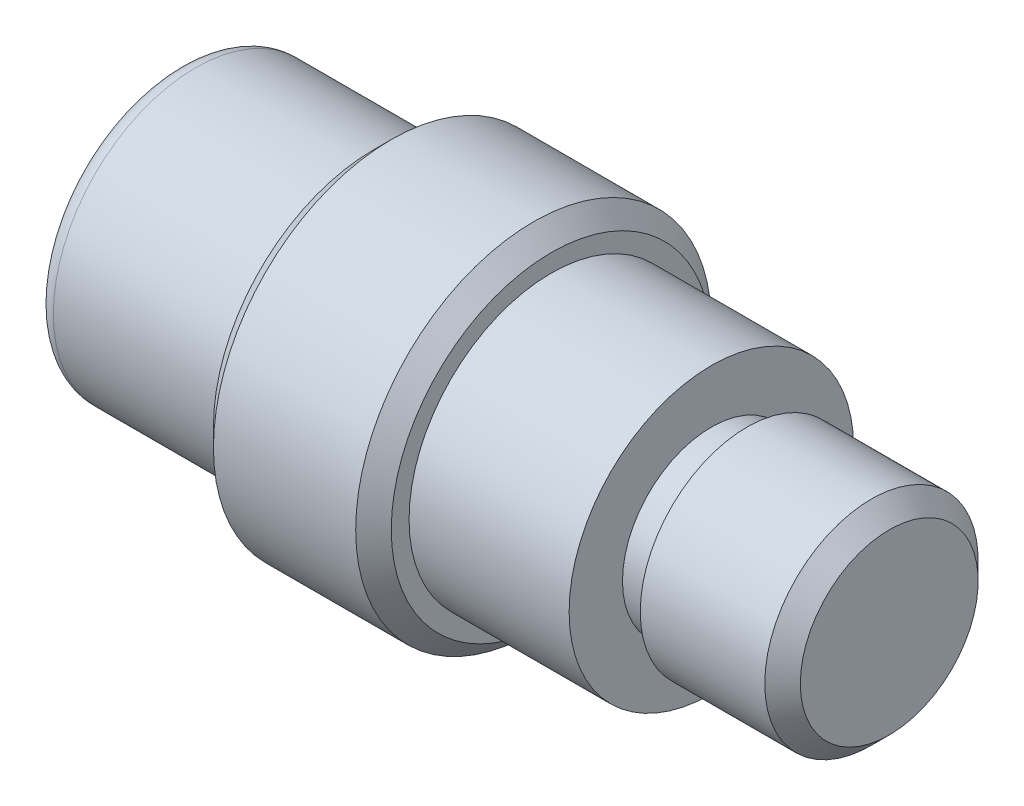
ISO-10303-21;
HEADER;
FILE_DESCRIPTION(('STEP AP214'),'2;1');
FILE_NAME('part.step','',(''),(''),'','','');
FILE_SCHEMA(('AUTOMOTIVE_DESIGN { 1 0 10303 214 1 1 1 1 }'));
ENDSEC;
DATA;
#1=APPLICATION_CONTEXT('core data for automotive mechanical design processes');
#2=APPLICATION_PROTOCOL_DEFINITION('international standard','automotive_design',2000,#1);
#3=PRODUCT_CONTEXT('',#1,'mechanical');
#4=PRODUCT('Part','Part','',(#3));
#5=PRODUCT_RELATED_PRODUCT_CATEGORY('part','',(#4));
#6=PRODUCT_DEFINITION_FORMATION('','',#4);
#7=PRODUCT_DEFINITION_CONTEXT('part definition',#1,'design');
#8=PRODUCT_DEFINITION('design','',#6,#7);
#9=PRODUCT_DEFINITION_SHAPE('','',#8);
#10=(LENGTH_UNIT() NAMED_UNIT(*) SI_UNIT(.MILLI.,.METRE.));
#11=(NAMED_UNIT(*) PLANE_ANGLE_UNIT() SI_UNIT($,.RADIAN.));
#12=(NAMED_UNIT(*) SI_UNIT($,.STERADIAN.) SOLID_ANGLE_UNIT());
#13=UNCERTAINTY_MEASURE_WITH_UNIT(LENGTH_MEASURE(1.E-05),#10,'distance_accuracy_value','');
#14=(GEOMETRIC_REPRESENTATION_CONTEXT(3) GLOBAL_UNCERTAINTY_ASSIGNED_CONTEXT((#13)) GLOBAL_UNIT_ASSIGNED_CONTEXT((#10,
#11,#12)) REPRESENTATION_CONTEXT('',''));
#15=CARTESIAN_POINT('',(0.,0.,0.));
#16=DIRECTION('',(0.,0.,1.));
#17=DIRECTION('',(1.,0.,0.));
#18=AXIS2_PLACEMENT_3D('',#15,#16,#17);
#19=CARTESIAN_POINT('',(40.,6.00000000000001,0.));
#20=DIRECTION('',(-1.,0.,0.));
#21=DIRECTION('',(0.,0.,1.));
#22=AXIS2_PLACEMENT_3D('',#19,#20,#21);
#23=PLANE('',#22);
#24=CARTESIAN_POINT('',(40.,0.,0.));
#25=DIRECTION('',(-1.,0.,0.));
#26=DIRECTION('',(0.,0.,1.));
#27=AXIS2_PLACEMENT_3D('',#24,#25,#26);
#28=CIRCLE('',#27,4.99999999999999);
#29=CARTESIAN_POINT('',(40.,0.,4.99999999999999));
#30=VERTEX_POINT('',#29);
#31=EDGE_CURVE('E10',#30,#30,#28,.F.);
#32=ORIENTED_EDGE('',*,*,#31,.T.);
#33=EDGE_LOOP('',(#32));
#34=FACE_BOUND('',#33,.T.);
#35=ADVANCED_FACE('F35',(#34),#23,.F.);
#36=CARTESIAN_POINT('',(0.,0.,0.));
#37=DIRECTION('',(-1.,0.,0.));
#38=DIRECTION('',(0.,0.,1.));
#39=AXIS2_PLACEMENT_3D('',#36,#37,#38);
#40=CYLINDRICAL_SURFACE('',#39,6.00000000000001);
#41=CARTESIAN_POINT('',(39.,0.,0.));
#42=DIRECTION('',(-1.,0.,0.));
#43=DIRECTION('',(0.,0.,1.));
#44=AXIS2_PLACEMENT_3D('',#41,#42,#43);
#45=CIRCLE('',#44,6.00000000000001);
#46=CARTESIAN_POINT('',(39.,0.,6.00000000000001));
#47=VERTEX_POINT('',#46);
#48=EDGE_CURVE('E42',#47,#47,#45,.T.);
#49=ORIENTED_EDGE('',*,*,#48,.T.);
#50=EDGE_LOOP('',(#49));
#51=FACE_BOUND('',#50,.T.);
#52=CARTESIAN_POINT('',(32.,0.,0.));
#53=DIRECTION('',(-1.,0.,0.));
#54=DIRECTION('',(0.,0.,1.));
#55=AXIS2_PLACEMENT_3D('',#52,#53,#54);
#56=CIRCLE('',#55,6.00000000000001);
#57=CARTESIAN_POINT('',(32.,0.,6.00000000000001));
#58=VERTEX_POINT('',#57);
#59=EDGE_CURVE('E61',#58,#58,#56,.T.);
#60=ORIENTED_EDGE('',*,*,#59,.F.);
#61=EDGE_LOOP('',(#60));
#62=FACE_BOUND('',#61,.T.);
#63=ADVANCED_FACE('F112',(#51,#62),#40,.T.);
#64=CARTESIAN_POINT('',(32.,5.00000000000001,0.));
#65=DIRECTION('',(1.,0.,0.));
#66=DIRECTION('',(0.,0.,-1.));
#67=AXIS2_PLACEMENT_3D('',#64,#65,#66);
#68=PLANE('',#67);
#69=CARTESIAN_POINT('',(32.,0.,0.));
#70=DIRECTION('',(-1.,0.,0.));
#71=DIRECTION('',(0.,0.,1.));
#72=AXIS2_PLACEMENT_3D('',#69,#70,#71);
#73=CIRCLE('',#72,5.00000000000001);
#74=CARTESIAN_POINT('',(32.,0.,5.00000000000001));
#75=VERTEX_POINT('',#74);
#76=EDGE_CURVE('E64',#75,#75,#73,.T.);
#77=ORIENTED_EDGE('',*,*,#76,.F.);
#78=EDGE_LOOP('',(#77));
#79=FACE_BOUND('',#78,.T.);
#80=ORIENTED_EDGE('',*,*,#59,.T.);
#81=EDGE_LOOP('',(#80));
#82=FACE_BOUND('',#81,.T.);
#83=ADVANCED_FACE('F117',(#79,#82),#68,.F.);
#84=CARTESIAN_POINT('',(0.,0.,0.));
#85=DIRECTION('',(-1.,0.,0.));
#86=DIRECTION('',(0.,0.,1.));
#87=AXIS2_PLACEMENT_3D('',#84,#85,#86);
#88=CYLINDRICAL_SURFACE('',#87,5.00000000000001);
#89=CARTESIAN_POINT('',(30.,0.,0.));
#90=DIRECTION('',(-1.,0.,0.));
#91=DIRECTION('',(0.,0.,1.));
#92=AXIS2_PLACEMENT_3D('',#89,#90,#91);
#93=CIRCLE('',#92,5.00000000000001);
#94=CARTESIAN_POINT('',(30.,0.,5.00000000000001));
#95=VERTEX_POINT('',#94);
#96=EDGE_CURVE('E67',#95,#95,#93,.T.);
#97=ORIENTED_EDGE('',*,*,#96,.F.);
#98=EDGE_LOOP('',(#97));
#99=FACE_BOUND('',#98,.T.);
#100=ORIENTED_EDGE('',*,*,#76,.T.);
#101=EDGE_LOOP('',(#100));
#102=FACE_BOUND('',#101,.T.);
#103=ADVANCED_FACE('F219',(#99,#102),#88,.T.);
#104=CARTESIAN_POINT('',(30.,8.,0.));
#105=DIRECTION('',(-1.,0.,0.));
#106=DIRECTION('',(0.,0.,1.));
#107=AXIS2_PLACEMENT_3D('',#104,#105,#106);
#108=PLANE('',#107);
#109=CARTESIAN_POINT('',(30.,0.,0.));
#110=DIRECTION('',(-1.,0.,0.));
#111=DIRECTION('',(0.,0.,1.));
#112=AXIS2_PLACEMENT_3D('',#109,#110,#111);
#113=CIRCLE('',#112,8.);
#114=CARTESIAN_POINT('',(30.,0.,8.));
#115=VERTEX_POINT('',#114);
#116=EDGE_CURVE('E70',#115,#115,#113,.T.);
#117=ORIENTED_EDGE('',*,*,#116,.F.);
#118=EDGE_LOOP('',(#117));
#119=FACE_BOUND('',#118,.T.);
#120=ORIENTED_EDGE('',*,*,#96,.T.);
#121=EDGE_LOOP('',(#120));
#122=FACE_BOUND('',#121,.T.);
#123=ADVANCED_FACE('F209',(#119,#122),#108,.F.);
#124=CARTESIAN_POINT('',(0.,0.,0.));
#125=DIRECTION('',(-1.,0.,0.));
#126=DIRECTION('',(0.,0.,1.));
#127=AXIS2_PLACEMENT_3D('',#124,#125,#126);
#128=CYLINDRICAL_SURFACE('',#127,8.);
#129=CARTESIAN_POINT('',(21.,0.,0.));
#130=DIRECTION('',(-1.,0.,0.));
#131=DIRECTION('',(0.,0.,1.));
#132=AXIS2_PLACEMENT_3D('',#129,#130,#131);
#133=CIRCLE('',#132,8.);
#134=CARTESIAN_POINT('',(21.,0.,8.));
#135=VERTEX_POINT('',#134);
#136=EDGE_CURVE('E73',#135,#135,#133,.T.);
#137=ORIENTED_EDGE('',*,*,#136,.F.);
#138=EDGE_LOOP('',(#137));
#139=FACE_BOUND('',#138,.T.);
#140=ORIENTED_EDGE('',*,*,#116,.T.);
#141=EDGE_LOOP('',(#140));
#142=FACE_BOUND('',#141,.T.);
#143=ADVANCED_FACE('F182',(#139,#142),#128,.T.);
#144=CARTESIAN_POINT('',(21.,10.,0.));
#145=DIRECTION('',(-1.,0.,0.));
#146=DIRECTION('',(0.,0.,1.));
#147=AXIS2_PLACEMENT_3D('',#144,#145,#146);
#148=PLANE('',#147);
#149=CARTESIAN_POINT('',(21.,0.,0.));
#150=DIRECTION('',(-1.,0.,0.));
#151=DIRECTION('',(0.,0.,1.));
#152=AXIS2_PLACEMENT_3D('',#149,#150,#151);
#153=CIRCLE('',#152,9.00000000000001);
#154=CARTESIAN_POINT('',(21.,0.,9.00000000000001));
#155=VERTEX_POINT('',#154);
#156=EDGE_CURVE('E50',#155,#155,#153,.F.);
#157=ORIENTED_EDGE('',*,*,#156,.T.);
#158=EDGE_LOOP('',(#157));
#159=FACE_BOUND('',#158,.T.);
#160=ORIENTED_EDGE('',*,*,#136,.T.);
#161=EDGE_LOOP('',(#160));
#162=FACE_BOUND('',#161,.T.);
#163=ADVANCED_FACE('F108',(#159,#162),#148,.F.);
#164=CARTESIAN_POINT('',(0.,0.,0.));
#165=DIRECTION('',(-1.,0.,0.));
#166=DIRECTION('',(0.,0.,1.));
#167=AXIS2_PLACEMENT_3D('',#164,#165,#166);
#168=CYLINDRICAL_SURFACE('',#167,10.);
#169=CARTESIAN_POINT('',(20.,0.,0.));
#170=DIRECTION('',(-1.,0.,0.));
#171=DIRECTION('',(0.,0.,1.));
#172=AXIS2_PLACEMENT_3D('',#169,#170,#171);
#173=CIRCLE('',#172,10.);
#174=CARTESIAN_POINT('',(20.,0.,10.));
#175=VERTEX_POINT('',#174);
#176=EDGE_CURVE('E55',#175,#175,#173,.T.);
#177=ORIENTED_EDGE('',*,*,#176,.T.);
#178=EDGE_LOOP('',(#177));
#179=FACE_BOUND('',#178,.T.);
#180=CARTESIAN_POINT('',(12.,0.,0.));
#181=DIRECTION('',(1.,0.,0.));
#182=DIRECTION('',(0.,0.,-1.));
#183=AXIS2_PLACEMENT_3D('',#180,#181,#182);
#184=CIRCLE('',#183,10.);
#185=CARTESIAN_POINT('',(12.,0.,-10.));
#186=VERTEX_POINT('',#185);
#187=EDGE_CURVE('E58',#186,#186,#184,.T.);
#188=ORIENTED_EDGE('',*,*,#187,.T.);
#189=EDGE_LOOP('',(#188));
#190=FACE_BOUND('',#189,.T.);
#191=ADVANCED_FACE('F102',(#179,#190),#168,.T.);
#192=CARTESIAN_POINT('',(11.,8.,0.));
#193=DIRECTION('',(1.,0.,0.));
#194=DIRECTION('',(0.,0.,-1.));
#195=AXIS2_PLACEMENT_3D('',#192,#193,#194);
#196=PLANE('',#195);
#197=CARTESIAN_POINT('',(11.,0.,0.));
#198=DIRECTION('',(1.,0.,0.));
#199=DIRECTION('',(0.,0.,-1.));
#200=AXIS2_PLACEMENT_3D('',#197,#198,#199);
#201=CIRCLE('',#200,8.99999999999999);
#202=CARTESIAN_POINT('',(11.,0.,-8.99999999999999));
#203=VERTEX_POINT('',#202);
#204=EDGE_CURVE('E46',#203,#203,#201,.F.);
#205=ORIENTED_EDGE('',*,*,#204,.T.);
#206=EDGE_LOOP('',(#205));
#207=FACE_BOUND('',#206,.T.);
#208=CARTESIAN_POINT('',(11.,0.,0.));
#209=DIRECTION('',(-1.,0.,0.));
#210=DIRECTION('',(0.,0.,1.));
#211=AXIS2_PLACEMENT_3D('',#208,#209,#210);
#212=CIRCLE('',#211,8.);
#213=CARTESIAN_POINT('',(11.,0.,8.));
#214=VERTEX_POINT('',#213);
#215=EDGE_CURVE('E76',#214,#214,#212,.T.);
#216=ORIENTED_EDGE('',*,*,#215,.F.);
#217=EDGE_LOOP('',(#216));
#218=FACE_BOUND('',#217,.T.);
#219=ADVANCED_FACE('F97',(#207,#218),#196,.F.);
#220=CARTESIAN_POINT('',(0.,0.,0.));
#221=DIRECTION('',(-1.,0.,0.));
#222=DIRECTION('',(0.,0.,1.));
#223=AXIS2_PLACEMENT_3D('',#220,#221,#222);
#224=CYLINDRICAL_SURFACE('',#223,8.);
#225=CARTESIAN_POINT('',(1.,0.,0.));
#226=DIRECTION('',(-1.,0.,0.));
#227=DIRECTION('',(0.,0.,1.));
#228=AXIS2_PLACEMENT_3D('',#225,#226,#227);
#229=CIRCLE('',#228,8.);
#230=CARTESIAN_POINT('',(1.,0.,8.));
#231=VERTEX_POINT('',#230);
#232=EDGE_CURVE('E79',#231,#231,#229,.T.);
#233=ORIENTED_EDGE('',*,*,#232,.F.);
#234=EDGE_LOOP('',(#233));
#235=FACE_BOUND('',#234,.T.);
#236=ORIENTED_EDGE('',*,*,#215,.T.);
#237=EDGE_LOOP('',(#236));
#238=FACE_BOUND('',#237,.T.);
#239=ADVANCED_FACE('F91',(#235,#238),#224,.T.);
#240=CARTESIAN_POINT('',(1.,0.,0.));
#241=DIRECTION('',(-1.,0.,0.));
#242=DIRECTION('',(0.,0.,1.));
#243=AXIS2_PLACEMENT_3D('',#240,#241,#242);
#244=TOROIDAL_SURFACE('',#243,7.,1.);
#245=CARTESIAN_POINT('',(0.,0.,0.));
#246=DIRECTION('',(-1.,0.,0.));
#247=DIRECTION('',(0.,0.,1.));
#248=AXIS2_PLACEMENT_3D('',#245,#246,#247);
#249=CIRCLE('',#248,7.);
#250=CARTESIAN_POINT('',(0.,0.,7.));
#251=VERTEX_POINT('',#250);
#252=EDGE_CURVE('E82',#251,#251,#249,.T.);
#253=ORIENTED_EDGE('',*,*,#252,.F.);
#254=EDGE_LOOP('',(#253));
#255=FACE_BOUND('',#254,.T.);
#256=ORIENTED_EDGE('',*,*,#232,.T.);
#257=EDGE_LOOP('',(#256));
#258=FACE_BOUND('',#257,.T.);
#259=ADVANCED_FACE('F88',(#255,#258),#244,.T.);
#260=CARTESIAN_POINT('',(0.,0.,0.));
#261=DIRECTION('',(1.,0.,0.));
#262=DIRECTION('',(0.,0.,-1.));
#263=AXIS2_PLACEMENT_3D('',#260,#261,#262);
#264=PLANE('',#263);
#265=ORIENTED_EDGE('',*,*,#252,.T.);
#266=EDGE_LOOP('',(#265));
#267=FACE_BOUND('',#266,.T.);
#268=ADVANCED_FACE('F86',(#267),#264,.F.);
#269=CARTESIAN_POINT('',(20.,0.,0.));
#270=DIRECTION('',(-1.,0.,0.));
#271=DIRECTION('',(0.,0.,1.));
#272=AXIS2_PLACEMENT_3D('',#269,#270,#271);
#273=CONICAL_SURFACE('',#272,10.,0.78539816339745);
#274=ORIENTED_EDGE('',*,*,#156,.F.);
#275=EDGE_LOOP('',(#274));
#276=FACE_BOUND('',#275,.T.);
#277=ORIENTED_EDGE('',*,*,#176,.F.);
#278=EDGE_LOOP('',(#277));
#279=FACE_BOUND('',#278,.T.);
#280=ADVANCED_FACE('F121',(#276,#279),#273,.T.);
#281=CARTESIAN_POINT('',(11.,0.,0.));
#282=DIRECTION('',(1.,0.,0.));
#283=DIRECTION('',(0.,0.,-1.));
#284=AXIS2_PLACEMENT_3D('',#281,#282,#283);
#285=CONICAL_SURFACE('',#284,8.99999999999999,0.785398163397448);
#286=ORIENTED_EDGE('',*,*,#187,.F.);
#287=EDGE_LOOP('',(#286));
#288=FACE_BOUND('',#287,.T.);
#289=ORIENTED_EDGE('',*,*,#204,.F.);
#290=EDGE_LOOP('',(#289));
#291=FACE_BOUND('',#290,.T.);
#292=ADVANCED_FACE('F123',(#288,#291),#285,.T.);
#293=CARTESIAN_POINT('',(39.,0.,0.));
#294=DIRECTION('',(-1.,0.,0.));
#295=DIRECTION('',(0.,0.,1.));
#296=AXIS2_PLACEMENT_3D('',#293,#294,#295);
#297=CONICAL_SURFACE('',#296,6.00000000000001,0.785398163397452);
#298=ORIENTED_EDGE('',*,*,#31,.F.);
#299=EDGE_LOOP('',(#298));
#300=FACE_BOUND('',#299,.T.);
#301=ORIENTED_EDGE('',*,*,#48,.F.);
#302=EDGE_LOOP('',(#301));
#303=FACE_BOUND('',#302,.T.);
#304=ADVANCED_FACE('F37',(#300,#303),#297,.T.);
#305=CLOSED_SHELL('',(#35,#63,#83,#103,#123,#143,#163,#191,#219,#239,#259,#268,#280,#292,#304));
#306=MANIFOLD_SOLID_BREP('B2',#305);
#307=ADVANCED_BREP_SHAPE_REPRESENTATION('',(#18,#306),#14);
#308=SHAPE_DEFINITION_REPRESENTATION(#9,#307);
ENDSEC;
END-ISO-10303-21;
